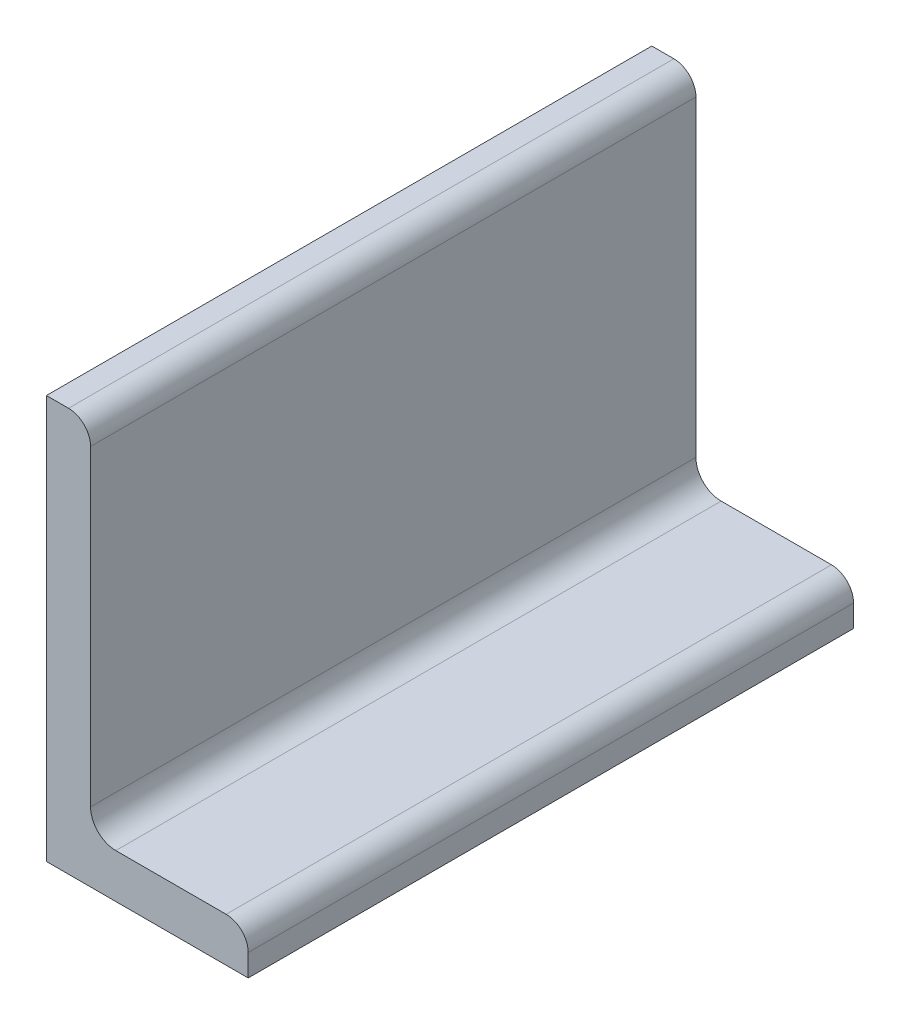
ISO-10303-21;
HEADER;
FILE_DESCRIPTION(('STEP AP214'),'2;1');
FILE_NAME('part.step','',(''),(''),'','','');
FILE_SCHEMA(('AUTOMOTIVE_DESIGN { 1 0 10303 214 1 1 1 1 }'));
ENDSEC;
DATA;
#1=APPLICATION_CONTEXT('core data for automotive mechanical design processes');
#2=APPLICATION_PROTOCOL_DEFINITION('international standard','automotive_design',2000,#1);
#3=PRODUCT_CONTEXT('',#1,'mechanical');
#4=PRODUCT('Part','Part','',(#3));
#5=PRODUCT_RELATED_PRODUCT_CATEGORY('part','',(#4));
#6=PRODUCT_DEFINITION_FORMATION('','',#4);
#7=PRODUCT_DEFINITION_CONTEXT('part definition',#1,'design');
#8=PRODUCT_DEFINITION('design','',#6,#7);
#9=PRODUCT_DEFINITION_SHAPE('','',#8);
#10=(LENGTH_UNIT() NAMED_UNIT(*) SI_UNIT(.MILLI.,.METRE.));
#11=(NAMED_UNIT(*) PLANE_ANGLE_UNIT() SI_UNIT($,.RADIAN.));
#12=(NAMED_UNIT(*) SI_UNIT($,.STERADIAN.) SOLID_ANGLE_UNIT());
#13=UNCERTAINTY_MEASURE_WITH_UNIT(LENGTH_MEASURE(1.E-05),#10,'distance_accuracy_value','');
#14=(GEOMETRIC_REPRESENTATION_CONTEXT(3) GLOBAL_UNCERTAINTY_ASSIGNED_CONTEXT((#13)) GLOBAL_UNIT_ASSIGNED_CONTEXT((#10,
#11,#12)) REPRESENTATION_CONTEXT('',''));
#15=CARTESIAN_POINT('',(0.,0.,0.));
#16=DIRECTION('',(0.,0.,1.));
#17=DIRECTION('',(1.,0.,0.));
#18=AXIS2_PLACEMENT_3D('',#15,#16,#17);
#19=CARTESIAN_POINT('',(0.865045893659089,203.678837479771,304.8));
#20=DIRECTION('',(1.,0.,0.));
#21=DIRECTION('',(0.,0.,-1.));
#22=AXIS2_PLACEMENT_3D('',#19,#20,#21);
#23=PLANE('',#22);
#24=DIRECTION('',(0.,-1.,0.));
#25=VECTOR('',#24,1.);
#26=CARTESIAN_POINT('',(0.865045893659089,203.678837479771,0.));
#27=LINE('',#26,#25);
#28=CARTESIAN_POINT('',(0.865045893659089,203.678837479771,0.));
#29=VERTEX_POINT('',#28);
#30=CARTESIAN_POINT('',(0.865045893659089,0.478837479771528,0.));
#31=VERTEX_POINT('',#30);
#32=EDGE_CURVE('E135',#29,#31,#27,.T.);
#33=ORIENTED_EDGE('',*,*,#32,.T.);
#34=DIRECTION('',(0.,0.,-1.));
#35=VECTOR('',#34,1.);
#36=CARTESIAN_POINT('',(0.865045893659089,0.478837479771528,304.8));
#37=LINE('',#36,#35);
#38=CARTESIAN_POINT('',(0.865045893659089,0.478837479771528,304.8));
#39=VERTEX_POINT('',#38);
#40=EDGE_CURVE('E11',#39,#31,#37,.T.);
#41=ORIENTED_EDGE('',*,*,#40,.F.);
#42=DIRECTION('',(0.,-1.,0.));
#43=VECTOR('',#42,1.);
#44=CARTESIAN_POINT('',(0.865045893659089,203.678837479771,304.8));
#45=LINE('',#44,#43);
#46=CARTESIAN_POINT('',(0.865045893659089,203.678837479771,304.8));
#47=VERTEX_POINT('',#46);
#48=EDGE_CURVE('E151',#47,#39,#45,.T.);
#49=ORIENTED_EDGE('',*,*,#48,.F.);
#50=DIRECTION('',(0.,0.,-1.));
#51=VECTOR('',#50,1.);
#52=CARTESIAN_POINT('',(0.865045893659089,203.678837479771,304.8));
#53=LINE('',#52,#51);
#54=EDGE_CURVE('E131',#47,#29,#53,.T.);
#55=ORIENTED_EDGE('',*,*,#54,.T.);
#56=EDGE_LOOP('',(#33,#41,#49,#55));
#57=FACE_BOUND('',#56,.T.);
#58=ADVANCED_FACE('F33',(#57),#23,.F.);
#59=CARTESIAN_POINT('',(0.865045893659089,0.478837479771528,304.8));
#60=DIRECTION('',(0.,1.,0.));
#61=DIRECTION('',(0.,0.,1.));
#62=AXIS2_PLACEMENT_3D('',#59,#60,#61);
#63=PLANE('',#62);
#64=DIRECTION('',(1.,0.,0.));
#65=VECTOR('',#64,1.);
#66=CARTESIAN_POINT('',(0.865045893659089,0.478837479771528,0.));
#67=LINE('',#66,#65);
#68=CARTESIAN_POINT('',(102.465045893659,0.478837479771528,0.));
#69=VERTEX_POINT('',#68);
#70=EDGE_CURVE('E138',#31,#69,#67,.T.);
#71=ORIENTED_EDGE('',*,*,#70,.T.);
#72=DIRECTION('',(0.,0.,-1.));
#73=VECTOR('',#72,1.);
#74=CARTESIAN_POINT('',(102.465045893659,0.478837479771528,304.8));
#75=LINE('',#74,#73);
#76=CARTESIAN_POINT('',(102.465045893659,0.478837479771528,304.8));
#77=VERTEX_POINT('',#76);
#78=EDGE_CURVE('E41',#77,#69,#75,.T.);
#79=ORIENTED_EDGE('',*,*,#78,.F.);
#80=DIRECTION('',(1.,0.,0.));
#81=VECTOR('',#80,1.);
#82=CARTESIAN_POINT('',(0.865045893659089,0.478837479771528,304.8));
#83=LINE('',#82,#81);
#84=EDGE_CURVE('E95',#39,#77,#83,.T.);
#85=ORIENTED_EDGE('',*,*,#84,.F.);
#86=ORIENTED_EDGE('',*,*,#40,.T.);
#87=EDGE_LOOP('',(#71,#79,#85,#86));
#88=FACE_BOUND('',#87,.T.);
#89=ADVANCED_FACE('F194',(#88),#63,.F.);
#90=CARTESIAN_POINT('',(102.465045893659,0.478837479771528,304.8));
#91=DIRECTION('',(-1.,0.,0.));
#92=DIRECTION('',(0.,0.,1.));
#93=AXIS2_PLACEMENT_3D('',#90,#91,#92);
#94=PLANE('',#93);
#95=DIRECTION('',(0.,1.,0.));
#96=VECTOR('',#95,1.);
#97=CARTESIAN_POINT('',(102.465045893659,0.478837479771528,0.));
#98=LINE('',#97,#96);
#99=CARTESIAN_POINT('',(102.465045893659,11.5913374797715,0.));
#100=VERTEX_POINT('',#99);
#101=EDGE_CURVE('E140',#69,#100,#98,.T.);
#102=ORIENTED_EDGE('',*,*,#101,.T.);
#103=DIRECTION('',(0.,0.,-1.));
#104=VECTOR('',#103,1.);
#105=CARTESIAN_POINT('',(102.465045893659,11.5913374797715,304.8));
#106=LINE('',#105,#104);
#107=CARTESIAN_POINT('',(102.465045893659,11.5913374797715,304.8));
#108=VERTEX_POINT('',#107);
#109=EDGE_CURVE('E161',#108,#100,#106,.T.);
#110=ORIENTED_EDGE('',*,*,#109,.F.);
#111=DIRECTION('',(0.,1.,0.));
#112=VECTOR('',#111,1.);
#113=CARTESIAN_POINT('',(102.465045893659,0.478837479771528,304.8));
#114=LINE('',#113,#112);
#115=EDGE_CURVE('E169',#77,#108,#114,.T.);
#116=ORIENTED_EDGE('',*,*,#115,.F.);
#117=ORIENTED_EDGE('',*,*,#78,.T.);
#118=EDGE_LOOP('',(#102,#110,#116,#117));
#119=FACE_BOUND('',#118,.T.);
#120=ADVANCED_FACE('F167',(#119),#94,.F.);
#121=CARTESIAN_POINT('',(91.3525458936591,11.5913374797715,304.8));
#122=DIRECTION('',(0.,0.,-1.));
#123=DIRECTION('',(-1.,0.,0.));
#124=AXIS2_PLACEMENT_3D('',#121,#122,#123);
#125=CYLINDRICAL_SURFACE('',#124,11.1125);
#126=CARTESIAN_POINT('',(91.3525458936591,11.5913374797715,0.));
#127=DIRECTION('',(0.,0.,1.));
#128=DIRECTION('',(1.,0.,0.));
#129=AXIS2_PLACEMENT_3D('',#126,#127,#128);
#130=CIRCLE('',#129,11.1125);
#131=CARTESIAN_POINT('',(91.3525458936591,22.7038374797715,0.));
#132=VERTEX_POINT('',#131);
#133=EDGE_CURVE('E142',#100,#132,#130,.T.);
#134=ORIENTED_EDGE('',*,*,#133,.T.);
#135=DIRECTION('',(0.,0.,-1.));
#136=VECTOR('',#135,1.);
#137=CARTESIAN_POINT('',(91.3525458936591,22.7038374797715,304.8));
#138=LINE('',#137,#136);
#139=CARTESIAN_POINT('',(91.3525458936591,22.7038374797715,304.8));
#140=VERTEX_POINT('',#139);
#141=EDGE_CURVE('E158',#140,#132,#138,.T.);
#142=ORIENTED_EDGE('',*,*,#141,.F.);
#143=CARTESIAN_POINT('',(91.3525458936591,11.5913374797715,304.8));
#144=DIRECTION('',(0.,0.,1.));
#145=DIRECTION('',(1.,0.,0.));
#146=AXIS2_PLACEMENT_3D('',#143,#144,#145);
#147=CIRCLE('',#146,11.1125);
#148=EDGE_CURVE('E185',#108,#140,#147,.T.);
#149=ORIENTED_EDGE('',*,*,#148,.F.);
#150=ORIENTED_EDGE('',*,*,#109,.T.);
#151=EDGE_LOOP('',(#134,#142,#149,#150));
#152=FACE_BOUND('',#151,.T.);
#153=ADVANCED_FACE('F178',(#152),#125,.T.);
#154=CARTESIAN_POINT('',(91.3525458936591,22.7038374797715,304.8));
#155=DIRECTION('',(0.,-1.,0.));
#156=DIRECTION('',(0.,0.,-1.));
#157=AXIS2_PLACEMENT_3D('',#154,#155,#156);
#158=PLANE('',#157);
#159=DIRECTION('',(-1.,0.,0.));
#160=VECTOR('',#159,1.);
#161=CARTESIAN_POINT('',(91.3525458936591,22.7038374797715,0.));
#162=LINE('',#161,#160);
#163=CARTESIAN_POINT('',(35.7900458936591,22.7038374797715,0.));
#164=VERTEX_POINT('',#163);
#165=EDGE_CURVE('E144',#132,#164,#162,.T.);
#166=ORIENTED_EDGE('',*,*,#165,.T.);
#167=DIRECTION('',(0.,0.,-1.));
#168=VECTOR('',#167,1.);
#169=CARTESIAN_POINT('',(35.7900458936591,22.7038374797715,304.8));
#170=LINE('',#169,#168);
#171=CARTESIAN_POINT('',(35.7900458936591,22.7038374797715,304.8));
#172=VERTEX_POINT('',#171);
#173=EDGE_CURVE('E155',#172,#164,#170,.T.);
#174=ORIENTED_EDGE('',*,*,#173,.F.);
#175=DIRECTION('',(-1.,0.,0.));
#176=VECTOR('',#175,1.);
#177=CARTESIAN_POINT('',(91.3525458936591,22.7038374797715,304.8));
#178=LINE('',#177,#176);
#179=EDGE_CURVE('E184',#140,#172,#178,.T.);
#180=ORIENTED_EDGE('',*,*,#179,.F.);
#181=ORIENTED_EDGE('',*,*,#141,.T.);
#182=EDGE_LOOP('',(#166,#174,#180,#181));
#183=FACE_BOUND('',#182,.T.);
#184=ADVANCED_FACE('F182',(#183),#158,.F.);
#185=CARTESIAN_POINT('',(35.7900458936591,35.4038374797715,304.8));
#186=DIRECTION('',(0.,0.,-1.));
#187=DIRECTION('',(-1.,0.,0.));
#188=AXIS2_PLACEMENT_3D('',#185,#186,#187);
#189=CYLINDRICAL_SURFACE('',#188,12.7);
#190=CARTESIAN_POINT('',(35.7900458936591,35.4038374797715,0.));
#191=DIRECTION('',(0.,0.,-1.));
#192=DIRECTION('',(1.,0.,0.));
#193=AXIS2_PLACEMENT_3D('',#190,#191,#192);
#194=CIRCLE('',#193,12.7);
#195=CARTESIAN_POINT('',(23.0900458936591,35.4038374797715,0.));
#196=VERTEX_POINT('',#195);
#197=EDGE_CURVE('E146',#164,#196,#194,.T.);
#198=ORIENTED_EDGE('',*,*,#197,.T.);
#199=DIRECTION('',(0.,0.,-1.));
#200=VECTOR('',#199,1.);
#201=CARTESIAN_POINT('',(23.0900458936591,35.4038374797715,304.8));
#202=LINE('',#201,#200);
#203=CARTESIAN_POINT('',(23.0900458936591,35.4038374797715,304.8));
#204=VERTEX_POINT('',#203);
#205=EDGE_CURVE('E126',#204,#196,#202,.T.);
#206=ORIENTED_EDGE('',*,*,#205,.F.);
#207=CARTESIAN_POINT('',(35.7900458936591,35.4038374797715,304.8));
#208=DIRECTION('',(0.,0.,-1.));
#209=DIRECTION('',(1.,0.,0.));
#210=AXIS2_PLACEMENT_3D('',#207,#208,#209);
#211=CIRCLE('',#210,12.7);
#212=EDGE_CURVE('E117',#172,#204,#211,.T.);
#213=ORIENTED_EDGE('',*,*,#212,.F.);
#214=ORIENTED_EDGE('',*,*,#173,.T.);
#215=EDGE_LOOP('',(#198,#206,#213,#214));
#216=FACE_BOUND('',#215,.T.);
#217=ADVANCED_FACE('F206',(#216),#189,.F.);
#218=CARTESIAN_POINT('',(23.0900458936591,35.4038374797715,304.8));
#219=DIRECTION('',(-1.,0.,0.));
#220=DIRECTION('',(0.,0.,1.));
#221=AXIS2_PLACEMENT_3D('',#218,#219,#220);
#222=PLANE('',#221);
#223=DIRECTION('',(0.,1.,0.));
#224=VECTOR('',#223,1.);
#225=CARTESIAN_POINT('',(23.0900458936591,35.4038374797715,0.));
#226=LINE('',#225,#224);
#227=CARTESIAN_POINT('',(23.0900458936591,192.566337479771,0.));
#228=VERTEX_POINT('',#227);
#229=EDGE_CURVE('E125',#196,#228,#226,.T.);
#230=ORIENTED_EDGE('',*,*,#229,.T.);
#231=DIRECTION('',(0.,0.,-1.));
#232=VECTOR('',#231,1.);
#233=CARTESIAN_POINT('',(23.0900458936591,192.566337479771,304.8));
#234=LINE('',#233,#232);
#235=CARTESIAN_POINT('',(23.0900458936591,192.566337479771,304.8));
#236=VERTEX_POINT('',#235);
#237=EDGE_CURVE('E122',#236,#228,#234,.T.);
#238=ORIENTED_EDGE('',*,*,#237,.F.);
#239=DIRECTION('',(0.,1.,0.));
#240=VECTOR('',#239,1.);
#241=CARTESIAN_POINT('',(23.0900458936591,35.4038374797715,304.8));
#242=LINE('',#241,#240);
#243=EDGE_CURVE('E111',#204,#236,#242,.T.);
#244=ORIENTED_EDGE('',*,*,#243,.F.);
#245=ORIENTED_EDGE('',*,*,#205,.T.);
#246=EDGE_LOOP('',(#230,#238,#244,#245));
#247=FACE_BOUND('',#246,.T.);
#248=ADVANCED_FACE('F123',(#247),#222,.F.);
#249=CARTESIAN_POINT('',(11.9775458936591,192.566337479771,304.8));
#250=DIRECTION('',(0.,0.,-1.));
#251=DIRECTION('',(-1.,0.,0.));
#252=AXIS2_PLACEMENT_3D('',#249,#250,#251);
#253=CYLINDRICAL_SURFACE('',#252,11.1125);
#254=CARTESIAN_POINT('',(11.9775458936591,192.566337479771,0.));
#255=DIRECTION('',(0.,0.,1.));
#256=DIRECTION('',(1.,0.,0.));
#257=AXIS2_PLACEMENT_3D('',#254,#255,#256);
#258=CIRCLE('',#257,11.1125);
#259=CARTESIAN_POINT('',(11.9775458936591,203.678837479771,0.));
#260=VERTEX_POINT('',#259);
#261=EDGE_CURVE('E81',#228,#260,#258,.T.);
#262=ORIENTED_EDGE('',*,*,#261,.T.);
#263=DIRECTION('',(0.,0.,-1.));
#264=VECTOR('',#263,1.);
#265=CARTESIAN_POINT('',(11.9775458936591,203.678837479771,304.8));
#266=LINE('',#265,#264);
#267=CARTESIAN_POINT('',(11.9775458936591,203.678837479771,304.8));
#268=VERTEX_POINT('',#267);
#269=EDGE_CURVE('E127',#268,#260,#266,.T.);
#270=ORIENTED_EDGE('',*,*,#269,.F.);
#271=CARTESIAN_POINT('',(11.9775458936591,192.566337479771,304.8));
#272=DIRECTION('',(0.,0.,1.));
#273=DIRECTION('',(1.,0.,0.));
#274=AXIS2_PLACEMENT_3D('',#271,#272,#273);
#275=CIRCLE('',#274,11.1125);
#276=EDGE_CURVE('E115',#236,#268,#275,.T.);
#277=ORIENTED_EDGE('',*,*,#276,.F.);
#278=ORIENTED_EDGE('',*,*,#237,.T.);
#279=EDGE_LOOP('',(#262,#270,#277,#278));
#280=FACE_BOUND('',#279,.T.);
#281=ADVANCED_FACE('F129',(#280),#253,.T.);
#282=CARTESIAN_POINT('',(11.9775458936591,203.678837479771,304.8));
#283=DIRECTION('',(0.,-1.,0.));
#284=DIRECTION('',(0.,0.,-1.));
#285=AXIS2_PLACEMENT_3D('',#282,#283,#284);
#286=PLANE('',#285);
#287=DIRECTION('',(-1.,0.,0.));
#288=VECTOR('',#287,1.);
#289=CARTESIAN_POINT('',(11.9775458936591,203.678837479771,0.));
#290=LINE('',#289,#288);
#291=EDGE_CURVE('E87',#260,#29,#290,.T.);
#292=ORIENTED_EDGE('',*,*,#291,.T.);
#293=ORIENTED_EDGE('',*,*,#54,.F.);
#294=DIRECTION('',(-1.,0.,0.));
#295=VECTOR('',#294,1.);
#296=CARTESIAN_POINT('',(11.9775458936591,203.678837479771,304.8));
#297=LINE('',#296,#295);
#298=EDGE_CURVE('E49',#268,#47,#297,.T.);
#299=ORIENTED_EDGE('',*,*,#298,.F.);
#300=ORIENTED_EDGE('',*,*,#269,.T.);
#301=EDGE_LOOP('',(#292,#293,#299,#300));
#302=FACE_BOUND('',#301,.T.);
#303=ADVANCED_FACE('F214',(#302),#286,.F.);
#304=CARTESIAN_POINT('',(91.3525458936591,11.5913374797715,304.8));
#305=DIRECTION('',(0.,0.,1.));
#306=DIRECTION('',(1.,0.,0.));
#307=AXIS2_PLACEMENT_3D('',#304,#305,#306);
#308=PLANE('',#307);
#309=ORIENTED_EDGE('',*,*,#48,.T.);
#310=ORIENTED_EDGE('',*,*,#84,.T.);
#311=ORIENTED_EDGE('',*,*,#115,.T.);
#312=ORIENTED_EDGE('',*,*,#148,.T.);
#313=ORIENTED_EDGE('',*,*,#179,.T.);
#314=ORIENTED_EDGE('',*,*,#212,.T.);
#315=ORIENTED_EDGE('',*,*,#243,.T.);
#316=ORIENTED_EDGE('',*,*,#276,.T.);
#317=ORIENTED_EDGE('',*,*,#298,.T.);
#318=EDGE_LOOP('',(#309,#310,#311,#312,#313,#314,#315,#316,#317));
#319=FACE_BOUND('',#318,.T.);
#320=ADVANCED_FACE('F113',(#319),#308,.T.);
#321=CARTESIAN_POINT('',(91.3525458936591,11.5913374797715,0.));
#322=DIRECTION('',(0.,0.,1.));
#323=DIRECTION('',(1.,0.,0.));
#324=AXIS2_PLACEMENT_3D('',#321,#322,#323);
#325=PLANE('',#324);
#326=ORIENTED_EDGE('',*,*,#32,.F.);
#327=ORIENTED_EDGE('',*,*,#291,.F.);
#328=ORIENTED_EDGE('',*,*,#261,.F.);
#329=ORIENTED_EDGE('',*,*,#229,.F.);
#330=ORIENTED_EDGE('',*,*,#197,.F.);
#331=ORIENTED_EDGE('',*,*,#165,.F.);
#332=ORIENTED_EDGE('',*,*,#133,.F.);
#333=ORIENTED_EDGE('',*,*,#101,.F.);
#334=ORIENTED_EDGE('',*,*,#70,.F.);
#335=EDGE_LOOP('',(#326,#327,#328,#329,#330,#331,#332,#333,#334));
#336=FACE_BOUND('',#335,.T.);
#337=ADVANCED_FACE('F173',(#336),#325,.F.);
#338=CLOSED_SHELL('',(#58,#89,#120,#153,#184,#217,#248,#281,#303,#320,#337));
#339=MANIFOLD_SOLID_BREP('B2',#338);
#340=ADVANCED_BREP_SHAPE_REPRESENTATION('',(#18,#339),#14);
#341=SHAPE_DEFINITION_REPRESENTATION(#9,#340);
ENDSEC;
END-ISO-10303-21;
